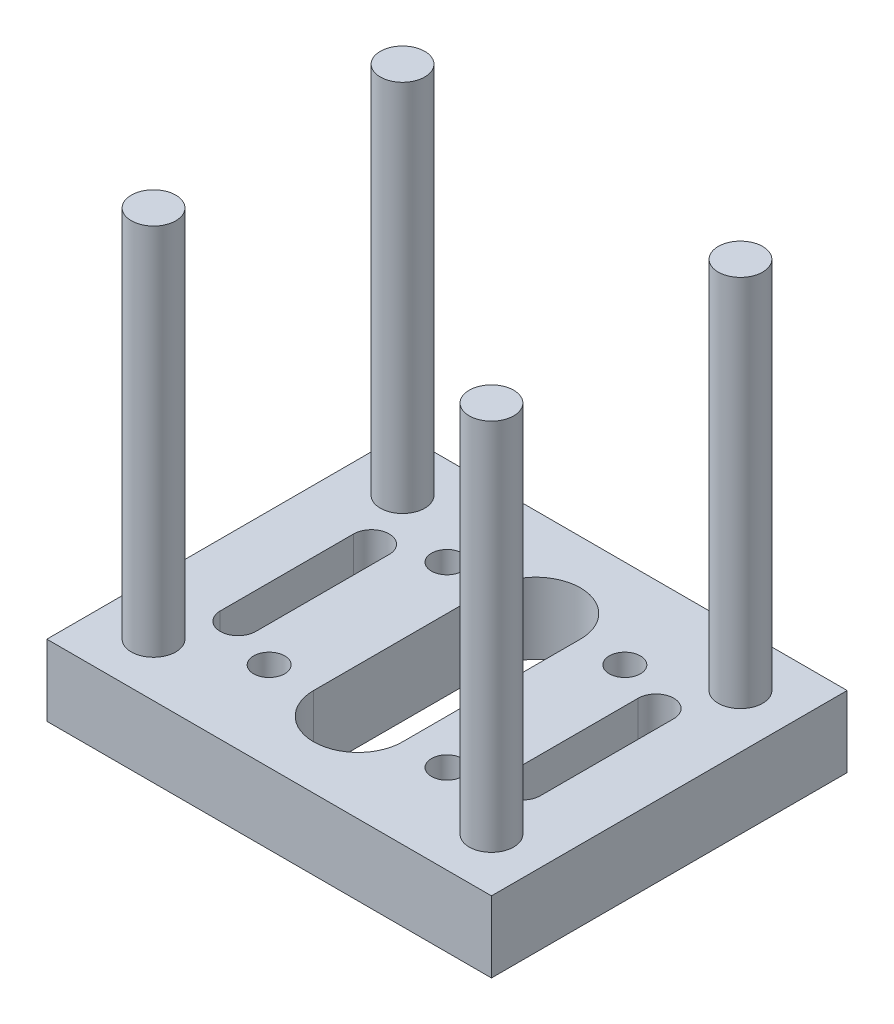
ISO-10303-21;
HEADER;
FILE_DESCRIPTION(('STEP AP214'),'2;1');
FILE_NAME('part.step','',(''),(''),'','','');
FILE_SCHEMA(('AUTOMOTIVE_DESIGN { 1 0 10303 214 1 1 1 1 }'));
ENDSEC;
DATA;
#1=APPLICATION_CONTEXT('core data for automotive mechanical design processes');
#2=APPLICATION_PROTOCOL_DEFINITION('international standard','automotive_design',2000,#1);
#3=PRODUCT_CONTEXT('',#1,'mechanical');
#4=PRODUCT('Part','Part','',(#3));
#5=PRODUCT_RELATED_PRODUCT_CATEGORY('part','',(#4));
#6=PRODUCT_DEFINITION_FORMATION('','',#4);
#7=PRODUCT_DEFINITION_CONTEXT('part definition',#1,'design');
#8=PRODUCT_DEFINITION('design','',#6,#7);
#9=PRODUCT_DEFINITION_SHAPE('','',#8);
#10=(LENGTH_UNIT() NAMED_UNIT(*) SI_UNIT(.MILLI.,.METRE.));
#11=(NAMED_UNIT(*) PLANE_ANGLE_UNIT() SI_UNIT($,.RADIAN.));
#12=(NAMED_UNIT(*) SI_UNIT($,.STERADIAN.) SOLID_ANGLE_UNIT());
#13=UNCERTAINTY_MEASURE_WITH_UNIT(LENGTH_MEASURE(1.E-05),#10,'distance_accuracy_value','');
#14=(GEOMETRIC_REPRESENTATION_CONTEXT(3) GLOBAL_UNCERTAINTY_ASSIGNED_CONTEXT((#13)) GLOBAL_UNIT_ASSIGNED_CONTEXT((#10,
#11,#12)) REPRESENTATION_CONTEXT('',''));
#15=CARTESIAN_POINT('',(0.,0.,0.));
#16=DIRECTION('',(0.,0.,1.));
#17=DIRECTION('',(1.,0.,0.));
#18=AXIS2_PLACEMENT_3D('',#15,#16,#17);
#19=CARTESIAN_POINT('',(0.,8.,0.));
#20=DIRECTION('',(0.,-1.,0.));
#21=DIRECTION('',(0.,0.,-1.));
#22=AXIS2_PLACEMENT_3D('',#19,#20,#21);
#23=PLANE('',#22);
#24=CARTESIAN_POINT('',(16.,8.,-7.5));
#25=DIRECTION('',(0.,1.,0.));
#26=DIRECTION('',(0.,0.,-1.));
#27=AXIS2_PLACEMENT_3D('',#24,#25,#26);
#28=CIRCLE('',#27,2.);
#29=CARTESIAN_POINT('',(18.,8.,-7.5));
#30=VERTEX_POINT('',#29);
#31=CARTESIAN_POINT('',(14.,8.,-7.5));
#32=VERTEX_POINT('',#31);
#33=EDGE_CURVE('E193',#30,#32,#28,.T.);
#34=ORIENTED_EDGE('',*,*,#33,.F.);
#35=DIRECTION('',(0.,0.,-1.));
#36=VECTOR('',#35,1.);
#37=CARTESIAN_POINT('',(18.,8.,-7.5));
#38=LINE('',#37,#36);
#39=CARTESIAN_POINT('',(18.,8.,7.5));
#40=VERTEX_POINT('',#39);
#41=EDGE_CURVE('E201',#40,#30,#38,.T.);
#42=ORIENTED_EDGE('',*,*,#41,.F.);
#43=CARTESIAN_POINT('',(16.,8.,7.5));
#44=DIRECTION('',(0.,1.,0.));
#45=DIRECTION('',(0.,0.,-1.));
#46=AXIS2_PLACEMENT_3D('',#43,#44,#45);
#47=CIRCLE('',#46,2.);
#48=CARTESIAN_POINT('',(14.,8.,7.5));
#49=VERTEX_POINT('',#48);
#50=EDGE_CURVE('E198',#49,#40,#47,.T.);
#51=ORIENTED_EDGE('',*,*,#50,.F.);
#52=DIRECTION('',(0.,0.,1.));
#53=VECTOR('',#52,1.);
#54=CARTESIAN_POINT('',(14.,8.,-7.5));
#55=LINE('',#54,#53);
#56=EDGE_CURVE('E195',#32,#49,#55,.T.);
#57=ORIENTED_EDGE('',*,*,#56,.F.);
#58=EDGE_LOOP('',(#34,#42,#51,#57));
#59=FACE_BOUND('',#58,.T.);
#60=CARTESIAN_POINT('',(19.,8.,14.));
#61=DIRECTION('',(0.,1.,0.));
#62=DIRECTION('',(0.,0.,1.));
#63=AXIS2_PLACEMENT_3D('',#60,#61,#62);
#64=CIRCLE('',#63,2.5);
#65=CARTESIAN_POINT('',(19.,8.,16.5));
#66=VERTEX_POINT('',#65);
#67=EDGE_CURVE('E254',#66,#66,#64,.T.);
#68=ORIENTED_EDGE('',*,*,#67,.F.);
#69=EDGE_LOOP('',(#68));
#70=FACE_BOUND('',#69,.T.);
#71=CARTESIAN_POINT('',(19.,8.,-14.));
#72=DIRECTION('',(0.,1.,0.));
#73=DIRECTION('',(0.,0.,-1.));
#74=AXIS2_PLACEMENT_3D('',#71,#72,#73);
#75=CIRCLE('',#74,2.49999999999999);
#76=CARTESIAN_POINT('',(19.,8.,-16.5));
#77=VERTEX_POINT('',#76);
#78=EDGE_CURVE('E257',#77,#77,#75,.T.);
#79=ORIENTED_EDGE('',*,*,#78,.F.);
#80=EDGE_LOOP('',(#79));
#81=FACE_BOUND('',#80,.T.);
#82=CARTESIAN_POINT('',(-19.,8.,14.));
#83=DIRECTION('',(0.,1.,0.));
#84=DIRECTION('',(0.,0.,-1.));
#85=AXIS2_PLACEMENT_3D('',#82,#83,#84);
#86=CIRCLE('',#85,2.5);
#87=CARTESIAN_POINT('',(-19.,8.,11.5));
#88=VERTEX_POINT('',#87);
#89=EDGE_CURVE('E260',#88,#88,#86,.T.);
#90=ORIENTED_EDGE('',*,*,#89,.F.);
#91=EDGE_LOOP('',(#90));
#92=FACE_BOUND('',#91,.T.);
#93=CARTESIAN_POINT('',(-19.,8.,-14.));
#94=DIRECTION('',(0.,1.,0.));
#95=DIRECTION('',(0.,0.,1.));
#96=AXIS2_PLACEMENT_3D('',#93,#94,#95);
#97=CIRCLE('',#96,2.5);
#98=CARTESIAN_POINT('',(-19.,8.,-11.5));
#99=VERTEX_POINT('',#98);
#100=EDGE_CURVE('E263',#99,#99,#97,.T.);
#101=ORIENTED_EDGE('',*,*,#100,.F.);
#102=EDGE_LOOP('',(#101));
#103=FACE_BOUND('',#102,.T.);
#104=DIRECTION('',(0.,0.,-1.));
#105=VECTOR('',#104,1.);
#106=CARTESIAN_POINT('',(25.,8.,20.));
#107=LINE('',#106,#105);
#108=CARTESIAN_POINT('',(25.,8.,20.));
#109=VERTEX_POINT('',#108);
#110=CARTESIAN_POINT('',(25.,8.,-20.));
#111=VERTEX_POINT('',#110);
#112=EDGE_CURVE('E267',#109,#111,#107,.T.);
#113=ORIENTED_EDGE('',*,*,#112,.T.);
#114=DIRECTION('',(-1.,0.,0.));
#115=VECTOR('',#114,1.);
#116=CARTESIAN_POINT('',(-25.,8.,-20.));
#117=LINE('',#116,#115);
#118=CARTESIAN_POINT('',(-25.,8.,-20.));
#119=VERTEX_POINT('',#118);
#120=EDGE_CURVE('E270',#111,#119,#117,.T.);
#121=ORIENTED_EDGE('',*,*,#120,.T.);
#122=DIRECTION('',(0.,0.,1.));
#123=VECTOR('',#122,1.);
#124=CARTESIAN_POINT('',(-25.,8.,20.));
#125=LINE('',#124,#123);
#126=CARTESIAN_POINT('',(-25.,8.,20.));
#127=VERTEX_POINT('',#126);
#128=EDGE_CURVE('E273',#119,#127,#125,.T.);
#129=ORIENTED_EDGE('',*,*,#128,.T.);
#130=DIRECTION('',(1.,0.,0.));
#131=VECTOR('',#130,1.);
#132=CARTESIAN_POINT('',(-25.,8.,20.));
#133=LINE('',#132,#131);
#134=EDGE_CURVE('E275',#127,#109,#133,.T.);
#135=ORIENTED_EDGE('',*,*,#134,.T.);
#136=EDGE_LOOP('',(#113,#121,#129,#135));
#137=FACE_BOUND('',#136,.T.);
#138=CARTESIAN_POINT('',(-16.,8.,-7.5));
#139=DIRECTION('',(0.,1.,0.));
#140=DIRECTION('',(0.,0.,1.));
#141=AXIS2_PLACEMENT_3D('',#138,#139,#140);
#142=CIRCLE('',#141,2.);
#143=CARTESIAN_POINT('',(-14.,8.,-7.5));
#144=VERTEX_POINT('',#143);
#145=CARTESIAN_POINT('',(-18.,8.,-7.5));
#146=VERTEX_POINT('',#145);
#147=EDGE_CURVE('E224',#144,#146,#142,.T.);
#148=ORIENTED_EDGE('',*,*,#147,.F.);
#149=DIRECTION('',(0.,0.,-1.));
#150=VECTOR('',#149,1.);
#151=CARTESIAN_POINT('',(-14.,8.,-7.5));
#152=LINE('',#151,#150);
#153=CARTESIAN_POINT('',(-14.,8.,7.5));
#154=VERTEX_POINT('',#153);
#155=EDGE_CURVE('E232',#154,#144,#152,.T.);
#156=ORIENTED_EDGE('',*,*,#155,.F.);
#157=CARTESIAN_POINT('',(-16.,8.,7.5));
#158=DIRECTION('',(0.,1.,0.));
#159=DIRECTION('',(0.,0.,1.));
#160=AXIS2_PLACEMENT_3D('',#157,#158,#159);
#161=CIRCLE('',#160,2.);
#162=CARTESIAN_POINT('',(-18.,8.,7.5));
#163=VERTEX_POINT('',#162);
#164=EDGE_CURVE('E229',#163,#154,#161,.T.);
#165=ORIENTED_EDGE('',*,*,#164,.F.);
#166=DIRECTION('',(0.,0.,1.));
#167=VECTOR('',#166,1.);
#168=CARTESIAN_POINT('',(-18.,8.,-7.5));
#169=LINE('',#168,#167);
#170=EDGE_CURVE('E226',#146,#163,#169,.T.);
#171=ORIENTED_EDGE('',*,*,#170,.F.);
#172=EDGE_LOOP('',(#148,#156,#165,#171));
#173=FACE_BOUND('',#172,.T.);
#174=CARTESIAN_POINT('',(0.,8.,-10.));
#175=DIRECTION('',(0.,1.,0.));
#176=DIRECTION('',(0.,0.,1.));
#177=AXIS2_PLACEMENT_3D('',#174,#175,#176);
#178=CIRCLE('',#177,5.);
#179=CARTESIAN_POINT('',(5.,8.,-10.));
#180=VERTEX_POINT('',#179);
#181=CARTESIAN_POINT('',(-5.,8.,-10.));
#182=VERTEX_POINT('',#181);
#183=EDGE_CURVE('E154',#180,#182,#178,.T.);
#184=ORIENTED_EDGE('',*,*,#183,.F.);
#185=DIRECTION('',(0.,0.,-1.));
#186=VECTOR('',#185,1.);
#187=CARTESIAN_POINT('',(5.,8.,-10.));
#188=LINE('',#187,#186);
#189=CARTESIAN_POINT('',(5.,8.,10.));
#190=VERTEX_POINT('',#189);
#191=EDGE_CURVE('E177',#190,#180,#188,.T.);
#192=ORIENTED_EDGE('',*,*,#191,.F.);
#193=CARTESIAN_POINT('',(0.,8.,10.));
#194=DIRECTION('',(0.,1.,0.));
#195=DIRECTION('',(0.,0.,1.));
#196=AXIS2_PLACEMENT_3D('',#193,#194,#195);
#197=CIRCLE('',#196,5.);
#198=CARTESIAN_POINT('',(-5.,8.,10.));
#199=VERTEX_POINT('',#198);
#200=EDGE_CURVE('E175',#199,#190,#197,.T.);
#201=ORIENTED_EDGE('',*,*,#200,.F.);
#202=DIRECTION('',(0.,0.,1.));
#203=VECTOR('',#202,1.);
#204=CARTESIAN_POINT('',(-5.,8.,-10.));
#205=LINE('',#204,#203);
#206=EDGE_CURVE('E162',#182,#199,#205,.T.);
#207=ORIENTED_EDGE('',*,*,#206,.F.);
#208=EDGE_LOOP('',(#184,#192,#201,#207));
#209=FACE_BOUND('',#208,.T.);
#210=CARTESIAN_POINT('',(-10.,8.,-9.99999999999999));
#211=DIRECTION('',(0.,1.,0.));
#212=DIRECTION('',(0.,0.,1.));
#213=AXIS2_PLACEMENT_3D('',#210,#211,#212);
#214=CIRCLE('',#213,1.75);
#215=CARTESIAN_POINT('',(-10.,8.,-8.24999999999999));
#216=VERTEX_POINT('',#215);
#217=EDGE_CURVE('E183',#216,#216,#214,.T.);
#218=ORIENTED_EDGE('',*,*,#217,.F.);
#219=EDGE_LOOP('',(#218));
#220=FACE_BOUND('',#219,.T.);
#221=CARTESIAN_POINT('',(-10.,8.,9.99999999999999));
#222=DIRECTION('',(0.,1.,0.));
#223=DIRECTION('',(0.,0.,-1.));
#224=AXIS2_PLACEMENT_3D('',#221,#222,#223);
#225=CIRCLE('',#224,1.75);
#226=CARTESIAN_POINT('',(-10.,8.,8.24999999999999));
#227=VERTEX_POINT('',#226);
#228=EDGE_CURVE('E466',#227,#227,#225,.T.);
#229=ORIENTED_EDGE('',*,*,#228,.F.);
#230=EDGE_LOOP('',(#229));
#231=FACE_BOUND('',#230,.T.);
#232=CARTESIAN_POINT('',(10.,8.,9.99999999999999));
#233=DIRECTION('',(0.,1.,0.));
#234=DIRECTION('',(0.,0.,1.));
#235=AXIS2_PLACEMENT_3D('',#232,#233,#234);
#236=CIRCLE('',#235,1.75);
#237=CARTESIAN_POINT('',(10.,8.,11.75));
#238=VERTEX_POINT('',#237);
#239=EDGE_CURVE('E460',#238,#238,#236,.T.);
#240=ORIENTED_EDGE('',*,*,#239,.F.);
#241=EDGE_LOOP('',(#240));
#242=FACE_BOUND('',#241,.T.);
#243=CARTESIAN_POINT('',(10.,8.,-9.99999999999999));
#244=DIRECTION('',(0.,1.,0.));
#245=DIRECTION('',(0.,0.,-1.));
#246=AXIS2_PLACEMENT_3D('',#243,#244,#245);
#247=CIRCLE('',#246,1.75);
#248=CARTESIAN_POINT('',(10.,8.,-11.75));
#249=VERTEX_POINT('',#248);
#250=EDGE_CURVE('E454',#249,#249,#247,.T.);
#251=ORIENTED_EDGE('',*,*,#250,.F.);
#252=EDGE_LOOP('',(#251));
#253=FACE_BOUND('',#252,.T.);
#254=ADVANCED_FACE('F41',(#59,#70,#81,#92,#103,#137,#173,#209,#220,#231,#242,#253),#23,.F.);
#255=CARTESIAN_POINT('',(0.,0.,0.));
#256=DIRECTION('',(0.,-1.,0.));
#257=DIRECTION('',(0.,0.,-1.));
#258=AXIS2_PLACEMENT_3D('',#255,#256,#257);
#259=PLANE('',#258);
#260=CARTESIAN_POINT('',(10.,0.,9.99999999999999));
#261=DIRECTION('',(0.,1.,0.));
#262=DIRECTION('',(0.,0.,1.));
#263=AXIS2_PLACEMENT_3D('',#260,#261,#262);
#264=CIRCLE('',#263,1.75);
#265=CARTESIAN_POINT('',(10.,0.,11.75));
#266=VERTEX_POINT('',#265);
#267=EDGE_CURVE('E457',#266,#266,#264,.T.);
#268=ORIENTED_EDGE('',*,*,#267,.T.);
#269=EDGE_LOOP('',(#268));
#270=FACE_BOUND('',#269,.T.);
#271=CARTESIAN_POINT('',(-10.,0.,-9.99999999999999));
#272=DIRECTION('',(0.,1.,0.));
#273=DIRECTION('',(0.,0.,1.));
#274=AXIS2_PLACEMENT_3D('',#271,#272,#273);
#275=CIRCLE('',#274,1.75);
#276=CARTESIAN_POINT('',(-10.,0.,-8.24999999999999));
#277=VERTEX_POINT('',#276);
#278=EDGE_CURVE('E469',#277,#277,#275,.T.);
#279=ORIENTED_EDGE('',*,*,#278,.T.);
#280=EDGE_LOOP('',(#279));
#281=FACE_BOUND('',#280,.T.);
#282=DIRECTION('',(0.,0.,-1.));
#283=VECTOR('',#282,1.);
#284=CARTESIAN_POINT('',(25.,0.,20.));
#285=LINE('',#284,#283);
#286=CARTESIAN_POINT('',(25.,0.,20.));
#287=VERTEX_POINT('',#286);
#288=CARTESIAN_POINT('',(25.,0.,-20.));
#289=VERTEX_POINT('',#288);
#290=EDGE_CURVE('E266',#287,#289,#285,.T.);
#291=ORIENTED_EDGE('',*,*,#290,.F.);
#292=DIRECTION('',(1.,0.,0.));
#293=VECTOR('',#292,1.);
#294=CARTESIAN_POINT('',(-25.,0.,20.));
#295=LINE('',#294,#293);
#296=CARTESIAN_POINT('',(-25.,0.,20.));
#297=VERTEX_POINT('',#296);
#298=EDGE_CURVE('E271',#297,#287,#295,.T.);
#299=ORIENTED_EDGE('',*,*,#298,.F.);
#300=DIRECTION('',(0.,0.,1.));
#301=VECTOR('',#300,1.);
#302=CARTESIAN_POINT('',(-25.,0.,20.));
#303=LINE('',#302,#301);
#304=CARTESIAN_POINT('',(-25.,0.,-20.));
#305=VERTEX_POINT('',#304);
#306=EDGE_CURVE('E282',#305,#297,#303,.T.);
#307=ORIENTED_EDGE('',*,*,#306,.F.);
#308=DIRECTION('',(-1.,0.,0.));
#309=VECTOR('',#308,1.);
#310=CARTESIAN_POINT('',(-25.,0.,-20.));
#311=LINE('',#310,#309);
#312=EDGE_CURVE('E280',#289,#305,#311,.T.);
#313=ORIENTED_EDGE('',*,*,#312,.F.);
#314=EDGE_LOOP('',(#291,#299,#307,#313));
#315=FACE_BOUND('',#314,.T.);
#316=DIRECTION('',(0.,0.,-1.));
#317=VECTOR('',#316,1.);
#318=CARTESIAN_POINT('',(-14.,0.,-7.5));
#319=LINE('',#318,#317);
#320=CARTESIAN_POINT('',(-14.,0.,7.5));
#321=VERTEX_POINT('',#320);
#322=CARTESIAN_POINT('',(-14.,0.,-7.5));
#323=VERTEX_POINT('',#322);
#324=EDGE_CURVE('E227',#321,#323,#319,.T.);
#325=ORIENTED_EDGE('',*,*,#324,.T.);
#326=CARTESIAN_POINT('',(-16.,0.,-7.5));
#327=DIRECTION('',(0.,1.,0.));
#328=DIRECTION('',(0.,0.,1.));
#329=AXIS2_PLACEMENT_3D('',#326,#327,#328);
#330=CIRCLE('',#329,2.);
#331=CARTESIAN_POINT('',(-18.,0.,-7.5));
#332=VERTEX_POINT('',#331);
#333=EDGE_CURVE('E223',#323,#332,#330,.T.);
#334=ORIENTED_EDGE('',*,*,#333,.T.);
#335=DIRECTION('',(0.,0.,1.));
#336=VECTOR('',#335,1.);
#337=CARTESIAN_POINT('',(-18.,0.,-7.5));
#338=LINE('',#337,#336);
#339=CARTESIAN_POINT('',(-18.,0.,7.5));
#340=VERTEX_POINT('',#339);
#341=EDGE_CURVE('E237',#332,#340,#338,.T.);
#342=ORIENTED_EDGE('',*,*,#341,.T.);
#343=CARTESIAN_POINT('',(-16.,0.,7.5));
#344=DIRECTION('',(0.,1.,0.));
#345=DIRECTION('',(0.,0.,1.));
#346=AXIS2_PLACEMENT_3D('',#343,#344,#345);
#347=CIRCLE('',#346,2.);
#348=EDGE_CURVE('E240',#340,#321,#347,.T.);
#349=ORIENTED_EDGE('',*,*,#348,.T.);
#350=EDGE_LOOP('',(#325,#334,#342,#349));
#351=FACE_BOUND('',#350,.T.);
#352=DIRECTION('',(0.,0.,-1.));
#353=VECTOR('',#352,1.);
#354=CARTESIAN_POINT('',(18.,0.,-7.5));
#355=LINE('',#354,#353);
#356=CARTESIAN_POINT('',(18.,0.,7.5));
#357=VERTEX_POINT('',#356);
#358=CARTESIAN_POINT('',(18.,0.,-7.5));
#359=VERTEX_POINT('',#358);
#360=EDGE_CURVE('E196',#357,#359,#355,.T.);
#361=ORIENTED_EDGE('',*,*,#360,.T.);
#362=CARTESIAN_POINT('',(16.,0.,-7.5));
#363=DIRECTION('',(0.,1.,0.));
#364=DIRECTION('',(0.,0.,-1.));
#365=AXIS2_PLACEMENT_3D('',#362,#363,#364);
#366=CIRCLE('',#365,2.);
#367=CARTESIAN_POINT('',(14.,0.,-7.5));
#368=VERTEX_POINT('',#367);
#369=EDGE_CURVE('E170',#359,#368,#366,.T.);
#370=ORIENTED_EDGE('',*,*,#369,.T.);
#371=DIRECTION('',(0.,0.,1.));
#372=VECTOR('',#371,1.);
#373=CARTESIAN_POINT('',(14.,0.,-7.5));
#374=LINE('',#373,#372);
#375=CARTESIAN_POINT('',(14.,0.,7.5));
#376=VERTEX_POINT('',#375);
#377=EDGE_CURVE('E206',#368,#376,#374,.T.);
#378=ORIENTED_EDGE('',*,*,#377,.T.);
#379=CARTESIAN_POINT('',(16.,0.,7.5));
#380=DIRECTION('',(0.,1.,0.));
#381=DIRECTION('',(0.,0.,-1.));
#382=AXIS2_PLACEMENT_3D('',#379,#380,#381);
#383=CIRCLE('',#382,2.);
#384=EDGE_CURVE('E209',#376,#357,#383,.T.);
#385=ORIENTED_EDGE('',*,*,#384,.T.);
#386=EDGE_LOOP('',(#361,#370,#378,#385));
#387=FACE_BOUND('',#386,.T.);
#388=DIRECTION('',(0.,0.,-1.));
#389=VECTOR('',#388,1.);
#390=CARTESIAN_POINT('',(5.,0.,-10.));
#391=LINE('',#390,#389);
#392=CARTESIAN_POINT('',(5.,0.,10.));
#393=VERTEX_POINT('',#392);
#394=CARTESIAN_POINT('',(5.,0.,-10.));
#395=VERTEX_POINT('',#394);
#396=EDGE_CURVE('E163',#393,#395,#391,.T.);
#397=ORIENTED_EDGE('',*,*,#396,.T.);
#398=CARTESIAN_POINT('',(0.,0.,-10.));
#399=DIRECTION('',(0.,1.,0.));
#400=DIRECTION('',(0.,0.,1.));
#401=AXIS2_PLACEMENT_3D('',#398,#399,#400);
#402=CIRCLE('',#401,5.);
#403=CARTESIAN_POINT('',(-5.,0.,-10.));
#404=VERTEX_POINT('',#403);
#405=EDGE_CURVE('E64',#395,#404,#402,.T.);
#406=ORIENTED_EDGE('',*,*,#405,.T.);
#407=DIRECTION('',(0.,0.,1.));
#408=VECTOR('',#407,1.);
#409=CARTESIAN_POINT('',(-5.,0.,-10.));
#410=LINE('',#409,#408);
#411=CARTESIAN_POINT('',(-5.,0.,10.));
#412=VERTEX_POINT('',#411);
#413=EDGE_CURVE('E169',#404,#412,#410,.T.);
#414=ORIENTED_EDGE('',*,*,#413,.T.);
#415=CARTESIAN_POINT('',(0.,0.,10.));
#416=DIRECTION('',(0.,1.,0.));
#417=DIRECTION('',(0.,0.,1.));
#418=AXIS2_PLACEMENT_3D('',#415,#416,#417);
#419=CIRCLE('',#418,5.);
#420=EDGE_CURVE('E185',#412,#393,#419,.T.);
#421=ORIENTED_EDGE('',*,*,#420,.T.);
#422=EDGE_LOOP('',(#397,#406,#414,#421));
#423=FACE_BOUND('',#422,.T.);
#424=CARTESIAN_POINT('',(-10.,0.,9.99999999999999));
#425=DIRECTION('',(0.,1.,0.));
#426=DIRECTION('',(0.,0.,-1.));
#427=AXIS2_PLACEMENT_3D('',#424,#425,#426);
#428=CIRCLE('',#427,1.75);
#429=CARTESIAN_POINT('',(-10.,0.,8.24999999999999));
#430=VERTEX_POINT('',#429);
#431=EDGE_CURVE('E463',#430,#430,#428,.T.);
#432=ORIENTED_EDGE('',*,*,#431,.T.);
#433=EDGE_LOOP('',(#432));
#434=FACE_BOUND('',#433,.T.);
#435=CARTESIAN_POINT('',(10.,0.,-9.99999999999999));
#436=DIRECTION('',(0.,1.,0.));
#437=DIRECTION('',(0.,0.,-1.));
#438=AXIS2_PLACEMENT_3D('',#435,#436,#437);
#439=CIRCLE('',#438,1.75);
#440=CARTESIAN_POINT('',(10.,0.,-11.75));
#441=VERTEX_POINT('',#440);
#442=EDGE_CURVE('E453',#441,#441,#439,.T.);
#443=ORIENTED_EDGE('',*,*,#442,.T.);
#444=EDGE_LOOP('',(#443));
#445=FACE_BOUND('',#444,.T.);
#446=ADVANCED_FACE('F300',(#270,#281,#315,#351,#387,#423,#434,#445),#259,.T.);
#447=CARTESIAN_POINT('',(25.,8.,20.));
#448=DIRECTION('',(-1.,0.,0.));
#449=DIRECTION('',(0.,0.,1.));
#450=AXIS2_PLACEMENT_3D('',#447,#448,#449);
#451=PLANE('',#450);
#452=ORIENTED_EDGE('',*,*,#290,.T.);
#453=DIRECTION('',(0.,-1.,0.));
#454=VECTOR('',#453,1.);
#455=CARTESIAN_POINT('',(25.,8.,-20.));
#456=LINE('',#455,#454);
#457=EDGE_CURVE('E11',#111,#289,#456,.T.);
#458=ORIENTED_EDGE('',*,*,#457,.F.);
#459=ORIENTED_EDGE('',*,*,#112,.F.);
#460=DIRECTION('',(0.,-1.,0.));
#461=VECTOR('',#460,1.);
#462=CARTESIAN_POINT('',(25.,8.,20.));
#463=LINE('',#462,#461);
#464=EDGE_CURVE('E277',#109,#287,#463,.T.);
#465=ORIENTED_EDGE('',*,*,#464,.T.);
#466=EDGE_LOOP('',(#452,#458,#459,#465));
#467=FACE_BOUND('',#466,.T.);
#468=ADVANCED_FACE('F43',(#467),#451,.F.);
#469=CARTESIAN_POINT('',(-25.,8.,-20.));
#470=DIRECTION('',(0.,0.,1.));
#471=DIRECTION('',(1.,0.,0.));
#472=AXIS2_PLACEMENT_3D('',#469,#470,#471);
#473=PLANE('',#472);
#474=ORIENTED_EDGE('',*,*,#312,.T.);
#475=DIRECTION('',(0.,-1.,0.));
#476=VECTOR('',#475,1.);
#477=CARTESIAN_POINT('',(-25.,8.,-20.));
#478=LINE('',#477,#476);
#479=EDGE_CURVE('E49',#119,#305,#478,.T.);
#480=ORIENTED_EDGE('',*,*,#479,.F.);
#481=ORIENTED_EDGE('',*,*,#120,.F.);
#482=ORIENTED_EDGE('',*,*,#457,.T.);
#483=EDGE_LOOP('',(#474,#480,#481,#482));
#484=FACE_BOUND('',#483,.T.);
#485=ADVANCED_FACE('F311',(#484),#473,.F.);
#486=CARTESIAN_POINT('',(-25.,8.,20.));
#487=DIRECTION('',(1.,0.,0.));
#488=DIRECTION('',(0.,0.,-1.));
#489=AXIS2_PLACEMENT_3D('',#486,#487,#488);
#490=PLANE('',#489);
#491=ORIENTED_EDGE('',*,*,#306,.T.);
#492=DIRECTION('',(0.,-1.,0.));
#493=VECTOR('',#492,1.);
#494=CARTESIAN_POINT('',(-25.,8.,20.));
#495=LINE('',#494,#493);
#496=EDGE_CURVE('E287',#127,#297,#495,.T.);
#497=ORIENTED_EDGE('',*,*,#496,.F.);
#498=ORIENTED_EDGE('',*,*,#128,.F.);
#499=ORIENTED_EDGE('',*,*,#479,.T.);
#500=EDGE_LOOP('',(#491,#497,#498,#499));
#501=FACE_BOUND('',#500,.T.);
#502=ADVANCED_FACE('F294',(#501),#490,.F.);
#503=CARTESIAN_POINT('',(-25.,8.,20.));
#504=DIRECTION('',(0.,0.,-1.));
#505=DIRECTION('',(-1.,0.,0.));
#506=AXIS2_PLACEMENT_3D('',#503,#504,#505);
#507=PLANE('',#506);
#508=ORIENTED_EDGE('',*,*,#298,.T.);
#509=ORIENTED_EDGE('',*,*,#464,.F.);
#510=ORIENTED_EDGE('',*,*,#134,.F.);
#511=ORIENTED_EDGE('',*,*,#496,.T.);
#512=EDGE_LOOP('',(#508,#509,#510,#511));
#513=FACE_BOUND('',#512,.T.);
#514=ADVANCED_FACE('F304',(#513),#507,.F.);
#515=CARTESIAN_POINT('',(-16.,8.,-7.5));
#516=DIRECTION('',(0.,-1.,0.));
#517=DIRECTION('',(0.,0.,-1.));
#518=AXIS2_PLACEMENT_3D('',#515,#516,#517);
#519=CYLINDRICAL_SURFACE('',#518,2.);
#520=ORIENTED_EDGE('',*,*,#333,.F.);
#521=DIRECTION('',(0.,-1.,0.));
#522=VECTOR('',#521,1.);
#523=CARTESIAN_POINT('',(-14.,8.,-7.5));
#524=LINE('',#523,#522);
#525=EDGE_CURVE('E234',#144,#323,#524,.T.);
#526=ORIENTED_EDGE('',*,*,#525,.F.);
#527=ORIENTED_EDGE('',*,*,#147,.T.);
#528=DIRECTION('',(0.,-1.,0.));
#529=VECTOR('',#528,1.);
#530=CARTESIAN_POINT('',(-18.,8.,-7.5));
#531=LINE('',#530,#529);
#532=EDGE_CURVE('E251',#146,#332,#531,.T.);
#533=ORIENTED_EDGE('',*,*,#532,.T.);
#534=EDGE_LOOP('',(#520,#526,#527,#533));
#535=FACE_BOUND('',#534,.T.);
#536=ADVANCED_FACE('F329',(#535),#519,.F.);
#537=CARTESIAN_POINT('',(-18.,8.,-7.5));
#538=DIRECTION('',(1.,0.,0.));
#539=DIRECTION('',(0.,0.,-1.));
#540=AXIS2_PLACEMENT_3D('',#537,#538,#539);
#541=PLANE('',#540);
#542=ORIENTED_EDGE('',*,*,#341,.F.);
#543=ORIENTED_EDGE('',*,*,#532,.F.);
#544=ORIENTED_EDGE('',*,*,#170,.T.);
#545=DIRECTION('',(0.,-1.,0.));
#546=VECTOR('',#545,1.);
#547=CARTESIAN_POINT('',(-18.,8.,7.5));
#548=LINE('',#547,#546);
#549=EDGE_CURVE('E249',#163,#340,#548,.T.);
#550=ORIENTED_EDGE('',*,*,#549,.T.);
#551=EDGE_LOOP('',(#542,#543,#544,#550));
#552=FACE_BOUND('',#551,.T.);
#553=ADVANCED_FACE('F336',(#552),#541,.T.);
#554=CARTESIAN_POINT('',(-16.,8.,7.5));
#555=DIRECTION('',(0.,-1.,0.));
#556=DIRECTION('',(0.,0.,-1.));
#557=AXIS2_PLACEMENT_3D('',#554,#555,#556);
#558=CYLINDRICAL_SURFACE('',#557,2.);
#559=ORIENTED_EDGE('',*,*,#348,.F.);
#560=ORIENTED_EDGE('',*,*,#549,.F.);
#561=ORIENTED_EDGE('',*,*,#164,.T.);
#562=DIRECTION('',(0.,-1.,0.));
#563=VECTOR('',#562,1.);
#564=CARTESIAN_POINT('',(-14.,8.,7.5));
#565=LINE('',#564,#563);
#566=EDGE_CURVE('E247',#154,#321,#565,.T.);
#567=ORIENTED_EDGE('',*,*,#566,.T.);
#568=EDGE_LOOP('',(#559,#560,#561,#567));
#569=FACE_BOUND('',#568,.T.);
#570=ADVANCED_FACE('F341',(#569),#558,.F.);
#571=CARTESIAN_POINT('',(-14.,8.,-7.5));
#572=DIRECTION('',(-1.,0.,0.));
#573=DIRECTION('',(0.,0.,1.));
#574=AXIS2_PLACEMENT_3D('',#571,#572,#573);
#575=PLANE('',#574);
#576=ORIENTED_EDGE('',*,*,#324,.F.);
#577=ORIENTED_EDGE('',*,*,#566,.F.);
#578=ORIENTED_EDGE('',*,*,#155,.T.);
#579=ORIENTED_EDGE('',*,*,#525,.T.);
#580=EDGE_LOOP('',(#576,#577,#578,#579));
#581=FACE_BOUND('',#580,.T.);
#582=ADVANCED_FACE('F348',(#581),#575,.T.);
#583=CARTESIAN_POINT('',(16.,8.,-7.5));
#584=DIRECTION('',(0.,-1.,0.));
#585=DIRECTION('',(0.,0.,-1.));
#586=AXIS2_PLACEMENT_3D('',#583,#584,#585);
#587=CYLINDRICAL_SURFACE('',#586,2.);
#588=ORIENTED_EDGE('',*,*,#369,.F.);
#589=DIRECTION('',(0.,-1.,0.));
#590=VECTOR('',#589,1.);
#591=CARTESIAN_POINT('',(18.,8.,-7.5));
#592=LINE('',#591,#590);
#593=EDGE_CURVE('E203',#30,#359,#592,.T.);
#594=ORIENTED_EDGE('',*,*,#593,.F.);
#595=ORIENTED_EDGE('',*,*,#33,.T.);
#596=DIRECTION('',(0.,-1.,0.));
#597=VECTOR('',#596,1.);
#598=CARTESIAN_POINT('',(14.,8.,-7.5));
#599=LINE('',#598,#597);
#600=EDGE_CURVE('E220',#32,#368,#599,.T.);
#601=ORIENTED_EDGE('',*,*,#600,.T.);
#602=EDGE_LOOP('',(#588,#594,#595,#601));
#603=FACE_BOUND('',#602,.T.);
#604=ADVANCED_FACE('F361',(#603),#587,.F.);
#605=CARTESIAN_POINT('',(14.,8.,-7.5));
#606=DIRECTION('',(1.,0.,0.));
#607=DIRECTION('',(0.,0.,-1.));
#608=AXIS2_PLACEMENT_3D('',#605,#606,#607);
#609=PLANE('',#608);
#610=ORIENTED_EDGE('',*,*,#377,.F.);
#611=ORIENTED_EDGE('',*,*,#600,.F.);
#612=ORIENTED_EDGE('',*,*,#56,.T.);
#613=DIRECTION('',(0.,-1.,0.));
#614=VECTOR('',#613,1.);
#615=CARTESIAN_POINT('',(14.,8.,7.5));
#616=LINE('',#615,#614);
#617=EDGE_CURVE('E218',#49,#376,#616,.T.);
#618=ORIENTED_EDGE('',*,*,#617,.T.);
#619=EDGE_LOOP('',(#610,#611,#612,#618));
#620=FACE_BOUND('',#619,.T.);
#621=ADVANCED_FACE('F366',(#620),#609,.T.);
#622=CARTESIAN_POINT('',(16.,8.,7.5));
#623=DIRECTION('',(0.,-1.,0.));
#624=DIRECTION('',(0.,0.,-1.));
#625=AXIS2_PLACEMENT_3D('',#622,#623,#624);
#626=CYLINDRICAL_SURFACE('',#625,2.);
#627=ORIENTED_EDGE('',*,*,#384,.F.);
#628=ORIENTED_EDGE('',*,*,#617,.F.);
#629=ORIENTED_EDGE('',*,*,#50,.T.);
#630=DIRECTION('',(0.,-1.,0.));
#631=VECTOR('',#630,1.);
#632=CARTESIAN_POINT('',(18.,8.,7.5));
#633=LINE('',#632,#631);
#634=EDGE_CURVE('E216',#40,#357,#633,.T.);
#635=ORIENTED_EDGE('',*,*,#634,.T.);
#636=EDGE_LOOP('',(#627,#628,#629,#635));
#637=FACE_BOUND('',#636,.T.);
#638=ADVANCED_FACE('F370',(#637),#626,.F.);
#639=CARTESIAN_POINT('',(18.,8.,-7.5));
#640=DIRECTION('',(-1.,0.,0.));
#641=DIRECTION('',(0.,0.,1.));
#642=AXIS2_PLACEMENT_3D('',#639,#640,#641);
#643=PLANE('',#642);
#644=ORIENTED_EDGE('',*,*,#360,.F.);
#645=ORIENTED_EDGE('',*,*,#634,.F.);
#646=ORIENTED_EDGE('',*,*,#41,.T.);
#647=ORIENTED_EDGE('',*,*,#593,.T.);
#648=EDGE_LOOP('',(#644,#645,#646,#647));
#649=FACE_BOUND('',#648,.T.);
#650=ADVANCED_FACE('F374',(#649),#643,.T.);
#651=CARTESIAN_POINT('',(0.,8.,-10.));
#652=DIRECTION('',(0.,-1.,0.));
#653=DIRECTION('',(0.,0.,-1.));
#654=AXIS2_PLACEMENT_3D('',#651,#652,#653);
#655=CYLINDRICAL_SURFACE('',#654,5.);
#656=ORIENTED_EDGE('',*,*,#405,.F.);
#657=DIRECTION('',(0.,-1.,0.));
#658=VECTOR('',#657,1.);
#659=CARTESIAN_POINT('',(5.,8.,-10.));
#660=LINE('',#659,#658);
#661=EDGE_CURVE('E158',#180,#395,#660,.T.);
#662=ORIENTED_EDGE('',*,*,#661,.F.);
#663=ORIENTED_EDGE('',*,*,#183,.T.);
#664=DIRECTION('',(0.,-1.,0.));
#665=VECTOR('',#664,1.);
#666=CARTESIAN_POINT('',(-5.,8.,-10.));
#667=LINE('',#666,#665);
#668=EDGE_CURVE('E157',#182,#404,#667,.T.);
#669=ORIENTED_EDGE('',*,*,#668,.T.);
#670=EDGE_LOOP('',(#656,#662,#663,#669));
#671=FACE_BOUND('',#670,.T.);
#672=ADVANCED_FACE('F156',(#671),#655,.F.);
#673=CARTESIAN_POINT('',(-5.,8.,-10.));
#674=DIRECTION('',(1.,0.,0.));
#675=DIRECTION('',(0.,0.,-1.));
#676=AXIS2_PLACEMENT_3D('',#673,#674,#675);
#677=PLANE('',#676);
#678=ORIENTED_EDGE('',*,*,#413,.F.);
#679=ORIENTED_EDGE('',*,*,#668,.F.);
#680=ORIENTED_EDGE('',*,*,#206,.T.);
#681=DIRECTION('',(0.,-1.,0.));
#682=VECTOR('',#681,1.);
#683=CARTESIAN_POINT('',(-5.,8.,10.));
#684=LINE('',#683,#682);
#685=EDGE_CURVE('E171',#199,#412,#684,.T.);
#686=ORIENTED_EDGE('',*,*,#685,.T.);
#687=EDGE_LOOP('',(#678,#679,#680,#686));
#688=FACE_BOUND('',#687,.T.);
#689=ADVANCED_FACE('F166',(#688),#677,.T.);
#690=CARTESIAN_POINT('',(0.,8.,10.));
#691=DIRECTION('',(0.,-1.,0.));
#692=DIRECTION('',(0.,0.,-1.));
#693=AXIS2_PLACEMENT_3D('',#690,#691,#692);
#694=CYLINDRICAL_SURFACE('',#693,5.);
#695=ORIENTED_EDGE('',*,*,#420,.F.);
#696=ORIENTED_EDGE('',*,*,#685,.F.);
#697=ORIENTED_EDGE('',*,*,#200,.T.);
#698=DIRECTION('',(0.,-1.,0.));
#699=VECTOR('',#698,1.);
#700=CARTESIAN_POINT('',(5.,8.,10.));
#701=LINE('',#700,#699);
#702=EDGE_CURVE('E56',#190,#393,#701,.T.);
#703=ORIENTED_EDGE('',*,*,#702,.T.);
#704=EDGE_LOOP('',(#695,#696,#697,#703));
#705=FACE_BOUND('',#704,.T.);
#706=ADVANCED_FACE('F383',(#705),#694,.F.);
#707=CARTESIAN_POINT('',(5.,8.,-10.));
#708=DIRECTION('',(-1.,0.,0.));
#709=DIRECTION('',(0.,0.,1.));
#710=AXIS2_PLACEMENT_3D('',#707,#708,#709);
#711=PLANE('',#710);
#712=ORIENTED_EDGE('',*,*,#396,.F.);
#713=ORIENTED_EDGE('',*,*,#702,.F.);
#714=ORIENTED_EDGE('',*,*,#191,.T.);
#715=ORIENTED_EDGE('',*,*,#661,.T.);
#716=EDGE_LOOP('',(#712,#713,#714,#715));
#717=FACE_BOUND('',#716,.T.);
#718=ADVANCED_FACE('F386',(#717),#711,.T.);
#719=CARTESIAN_POINT('',(-10.,8.,-9.99999999999999));
#720=DIRECTION('',(0.,-1.,0.));
#721=DIRECTION('',(0.,0.,-1.));
#722=AXIS2_PLACEMENT_3D('',#719,#720,#721);
#723=CYLINDRICAL_SURFACE('',#722,1.75);
#724=ORIENTED_EDGE('',*,*,#217,.T.);
#725=EDGE_LOOP('',(#724));
#726=FACE_BOUND('',#725,.T.);
#727=ORIENTED_EDGE('',*,*,#278,.F.);
#728=EDGE_LOOP('',(#727));
#729=FACE_BOUND('',#728,.T.);
#730=ADVANCED_FACE('F390',(#726,#729),#723,.F.);
#731=CARTESIAN_POINT('',(-10.,8.,9.99999999999999));
#732=DIRECTION('',(0.,-1.,0.));
#733=DIRECTION('',(0.,0.,-1.));
#734=AXIS2_PLACEMENT_3D('',#731,#732,#733);
#735=CYLINDRICAL_SURFACE('',#734,1.75);
#736=ORIENTED_EDGE('',*,*,#228,.T.);
#737=EDGE_LOOP('',(#736));
#738=FACE_BOUND('',#737,.T.);
#739=ORIENTED_EDGE('',*,*,#431,.F.);
#740=EDGE_LOOP('',(#739));
#741=FACE_BOUND('',#740,.T.);
#742=ADVANCED_FACE('F393',(#738,#741),#735,.F.);
#743=CARTESIAN_POINT('',(10.,8.,9.99999999999999));
#744=DIRECTION('',(0.,-1.,0.));
#745=DIRECTION('',(0.,0.,-1.));
#746=AXIS2_PLACEMENT_3D('',#743,#744,#745);
#747=CYLINDRICAL_SURFACE('',#746,1.75);
#748=ORIENTED_EDGE('',*,*,#239,.T.);
#749=EDGE_LOOP('',(#748));
#750=FACE_BOUND('',#749,.T.);
#751=ORIENTED_EDGE('',*,*,#267,.F.);
#752=EDGE_LOOP('',(#751));
#753=FACE_BOUND('',#752,.T.);
#754=ADVANCED_FACE('F397',(#750,#753),#747,.F.);
#755=CARTESIAN_POINT('',(10.,8.,-9.99999999999999));
#756=DIRECTION('',(0.,-1.,0.));
#757=DIRECTION('',(0.,0.,-1.));
#758=AXIS2_PLACEMENT_3D('',#755,#756,#757);
#759=CYLINDRICAL_SURFACE('',#758,1.75);
#760=ORIENTED_EDGE('',*,*,#250,.T.);
#761=EDGE_LOOP('',(#760));
#762=FACE_BOUND('',#761,.T.);
#763=ORIENTED_EDGE('',*,*,#442,.F.);
#764=EDGE_LOOP('',(#763));
#765=FACE_BOUND('',#764,.T.);
#766=ADVANCED_FACE('F401',(#762,#765),#759,.F.);
#767=CARTESIAN_POINT('',(-19.,50.,14.));
#768=DIRECTION('',(0.,-1.,0.));
#769=DIRECTION('',(0.,0.,-1.));
#770=AXIS2_PLACEMENT_3D('',#767,#768,#769);
#771=CYLINDRICAL_SURFACE('',#770,2.5);
#772=CARTESIAN_POINT('',(-19.,50.,14.));
#773=DIRECTION('',(0.,1.,0.));
#774=DIRECTION('',(0.,0.,1.));
#775=AXIS2_PLACEMENT_3D('',#772,#773,#774);
#776=CIRCLE('',#775,2.5);
#777=CARTESIAN_POINT('',(-19.,50.,16.5));
#778=VERTEX_POINT('',#777);
#779=EDGE_CURVE('E450',#778,#778,#776,.F.);
#780=ORIENTED_EDGE('',*,*,#779,.T.);
#781=EDGE_LOOP('',(#780));
#782=FACE_BOUND('',#781,.T.);
#783=ORIENTED_EDGE('',*,*,#89,.T.);
#784=EDGE_LOOP('',(#783));
#785=FACE_BOUND('',#784,.T.);
#786=ADVANCED_FACE('F405',(#782,#785),#771,.T.);
#787=CARTESIAN_POINT('',(0.,50.,0.));
#788=DIRECTION('',(0.,1.,0.));
#789=DIRECTION('',(0.,0.,1.));
#790=AXIS2_PLACEMENT_3D('',#787,#788,#789);
#791=PLANE('',#790);
#792=ORIENTED_EDGE('',*,*,#779,.F.);
#793=EDGE_LOOP('',(#792));
#794=FACE_BOUND('',#793,.T.);
#795=ADVANCED_FACE('F409',(#794),#791,.T.);
#796=CARTESIAN_POINT('',(19.,50.,14.));
#797=DIRECTION('',(0.,-1.,0.));
#798=DIRECTION('',(0.,0.,-1.));
#799=AXIS2_PLACEMENT_3D('',#796,#797,#798);
#800=CYLINDRICAL_SURFACE('',#799,2.5);
#801=CARTESIAN_POINT('',(19.,50.,14.));
#802=DIRECTION('',(0.,1.,0.));
#803=DIRECTION('',(0.,0.,1.));
#804=AXIS2_PLACEMENT_3D('',#801,#802,#803);
#805=CIRCLE('',#804,2.5);
#806=CARTESIAN_POINT('',(19.,50.,16.5));
#807=VERTEX_POINT('',#806);
#808=EDGE_CURVE('E445',#807,#807,#805,.T.);
#809=ORIENTED_EDGE('',*,*,#808,.F.);
#810=EDGE_LOOP('',(#809));
#811=FACE_BOUND('',#810,.T.);
#812=ORIENTED_EDGE('',*,*,#67,.T.);
#813=EDGE_LOOP('',(#812));
#814=FACE_BOUND('',#813,.T.);
#815=ADVANCED_FACE('F413',(#811,#814),#800,.T.);
#816=CARTESIAN_POINT('',(0.,50.,0.));
#817=DIRECTION('',(0.,1.,0.));
#818=DIRECTION('',(0.,0.,1.));
#819=AXIS2_PLACEMENT_3D('',#816,#817,#818);
#820=PLANE('',#819);
#821=ORIENTED_EDGE('',*,*,#808,.T.);
#822=EDGE_LOOP('',(#821));
#823=FACE_BOUND('',#822,.T.);
#824=ADVANCED_FACE('F417',(#823),#820,.T.);
#825=CARTESIAN_POINT('',(19.,50.,-14.));
#826=DIRECTION('',(0.,-1.,0.));
#827=DIRECTION('',(0.,0.,-1.));
#828=AXIS2_PLACEMENT_3D('',#825,#826,#827);
#829=CYLINDRICAL_SURFACE('',#828,2.49999999999999);
#830=CARTESIAN_POINT('',(19.,50.,-14.));
#831=DIRECTION('',(0.,1.,0.));
#832=DIRECTION('',(0.,0.,1.));
#833=AXIS2_PLACEMENT_3D('',#830,#831,#832);
#834=CIRCLE('',#833,2.49999999999999);
#835=CARTESIAN_POINT('',(19.,50.,-11.5));
#836=VERTEX_POINT('',#835);
#837=EDGE_CURVE('E442',#836,#836,#834,.F.);
#838=ORIENTED_EDGE('',*,*,#837,.T.);
#839=EDGE_LOOP('',(#838));
#840=FACE_BOUND('',#839,.T.);
#841=ORIENTED_EDGE('',*,*,#78,.T.);
#842=EDGE_LOOP('',(#841));
#843=FACE_BOUND('',#842,.T.);
#844=ADVANCED_FACE('F421',(#840,#843),#829,.T.);
#845=CARTESIAN_POINT('',(0.,50.,0.));
#846=DIRECTION('',(0.,1.,0.));
#847=DIRECTION('',(0.,0.,1.));
#848=AXIS2_PLACEMENT_3D('',#845,#846,#847);
#849=PLANE('',#848);
#850=ORIENTED_EDGE('',*,*,#837,.F.);
#851=EDGE_LOOP('',(#850));
#852=FACE_BOUND('',#851,.T.);
#853=ADVANCED_FACE('F425',(#852),#849,.T.);
#854=CARTESIAN_POINT('',(-19.,50.,-14.));
#855=DIRECTION('',(0.,-1.,0.));
#856=DIRECTION('',(0.,0.,-1.));
#857=AXIS2_PLACEMENT_3D('',#854,#855,#856);
#858=CYLINDRICAL_SURFACE('',#857,2.5);
#859=CARTESIAN_POINT('',(-19.,50.,-14.));
#860=DIRECTION('',(0.,1.,0.));
#861=DIRECTION('',(0.,0.,1.));
#862=AXIS2_PLACEMENT_3D('',#859,#860,#861);
#863=CIRCLE('',#862,2.5);
#864=CARTESIAN_POINT('',(-19.,50.,-11.5));
#865=VERTEX_POINT('',#864);
#866=EDGE_CURVE('E441',#865,#865,#863,.T.);
#867=ORIENTED_EDGE('',*,*,#866,.F.);
#868=EDGE_LOOP('',(#867));
#869=FACE_BOUND('',#868,.T.);
#870=ORIENTED_EDGE('',*,*,#100,.T.);
#871=EDGE_LOOP('',(#870));
#872=FACE_BOUND('',#871,.T.);
#873=ADVANCED_FACE('F429',(#869,#872),#858,.T.);
#874=CARTESIAN_POINT('',(0.,50.,0.));
#875=DIRECTION('',(0.,1.,0.));
#876=DIRECTION('',(0.,0.,1.));
#877=AXIS2_PLACEMENT_3D('',#874,#875,#876);
#878=PLANE('',#877);
#879=ORIENTED_EDGE('',*,*,#866,.T.);
#880=EDGE_LOOP('',(#879));
#881=FACE_BOUND('',#880,.T.);
#882=ADVANCED_FACE('F433',(#881),#878,.T.);
#883=CLOSED_SHELL('',(#254,#446,#468,#485,#502,#514,#536,#553,#570,#582,#604,#621,#638,#650,
#672,#689,#706,#718,#730,#742,#754,#766,#786,#795,#815,#824,#844,#853,#873,#882));
#884=MANIFOLD_SOLID_BREP('B2',#883);
#885=ADVANCED_BREP_SHAPE_REPRESENTATION('',(#18,#884),#14);
#886=SHAPE_DEFINITION_REPRESENTATION(#9,#885);
ENDSEC;
END-ISO-10303-21;
